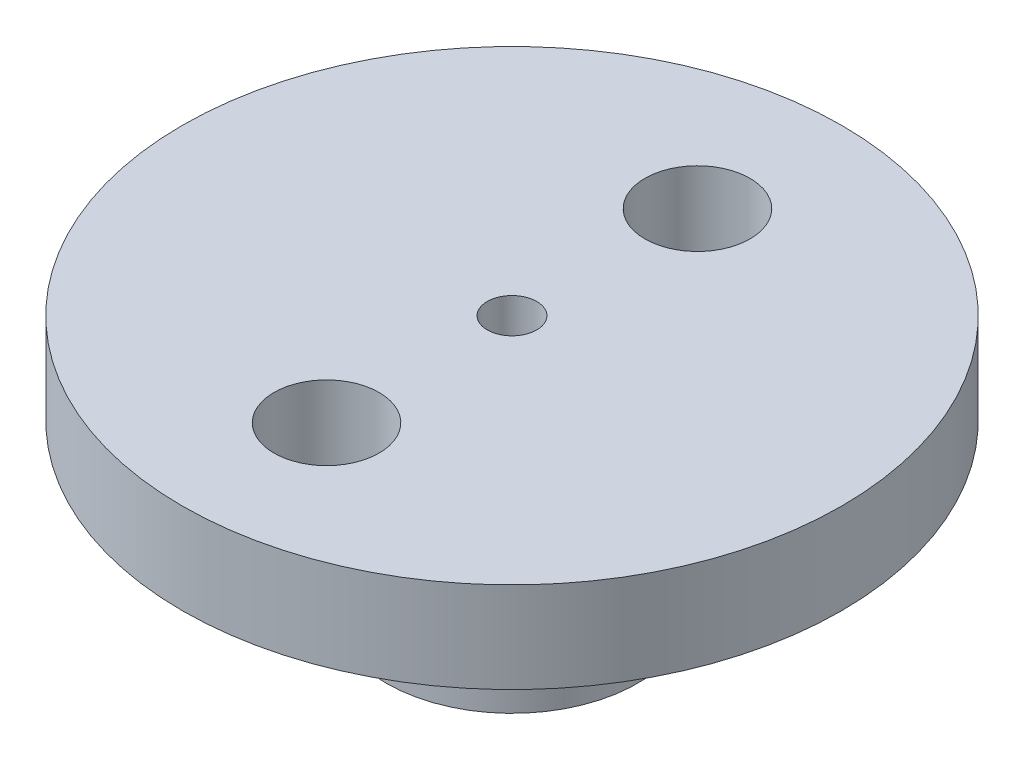
ISO-10303-21;
HEADER;
FILE_DESCRIPTION(('STEP AP214'),'2;1');
FILE_NAME('part.step','',(''),(''),'','','');
FILE_SCHEMA(('AUTOMOTIVE_DESIGN { 1 0 10303 214 1 1 1 1 }'));
ENDSEC;
DATA;
#1=APPLICATION_CONTEXT('core data for automotive mechanical design processes');
#2=APPLICATION_PROTOCOL_DEFINITION('international standard','automotive_design',2000,#1);
#3=PRODUCT_CONTEXT('',#1,'mechanical');
#4=PRODUCT('Part','Part','',(#3));
#5=PRODUCT_RELATED_PRODUCT_CATEGORY('part','',(#4));
#6=PRODUCT_DEFINITION_FORMATION('','',#4);
#7=PRODUCT_DEFINITION_CONTEXT('part definition',#1,'design');
#8=PRODUCT_DEFINITION('design','',#6,#7);
#9=PRODUCT_DEFINITION_SHAPE('','',#8);
#10=(LENGTH_UNIT() NAMED_UNIT(*) SI_UNIT(.MILLI.,.METRE.));
#11=(NAMED_UNIT(*) PLANE_ANGLE_UNIT() SI_UNIT($,.RADIAN.));
#12=(NAMED_UNIT(*) SI_UNIT($,.STERADIAN.) SOLID_ANGLE_UNIT());
#13=UNCERTAINTY_MEASURE_WITH_UNIT(LENGTH_MEASURE(1.E-05),#10,'distance_accuracy_value','');
#14=(GEOMETRIC_REPRESENTATION_CONTEXT(3) GLOBAL_UNCERTAINTY_ASSIGNED_CONTEXT((#13)) GLOBAL_UNIT_ASSIGNED_CONTEXT((#10,
#11,#12)) REPRESENTATION_CONTEXT('',''));
#15=CARTESIAN_POINT('',(0.,0.,0.));
#16=DIRECTION('',(0.,0.,1.));
#17=DIRECTION('',(1.,0.,0.));
#18=AXIS2_PLACEMENT_3D('',#15,#16,#17);
#19=CARTESIAN_POINT('',(0.,2.2,0.));
#20=DIRECTION('',(0.,-1.,0.));
#21=DIRECTION('',(0.,0.,-1.));
#22=AXIS2_PLACEMENT_3D('',#19,#20,#21);
#23=CYLINDRICAL_SURFACE('',#22,8.);
#24=CARTESIAN_POINT('',(0.,2.2,0.));
#25=DIRECTION('',(0.,1.,0.));
#26=DIRECTION('',(0.,0.,1.));
#27=AXIS2_PLACEMENT_3D('',#24,#25,#26);
#28=CIRCLE('',#27,8.);
#29=CARTESIAN_POINT('',(0.,2.2,8.));
#30=VERTEX_POINT('',#29);
#31=EDGE_CURVE('E44',#30,#30,#28,.T.);
#32=ORIENTED_EDGE('',*,*,#31,.F.);
#33=EDGE_LOOP('',(#32));
#34=FACE_BOUND('',#33,.T.);
#35=CARTESIAN_POINT('',(0.,0.,0.));
#36=DIRECTION('',(0.,1.,0.));
#37=DIRECTION('',(0.,0.,1.));
#38=AXIS2_PLACEMENT_3D('',#35,#36,#37);
#39=CIRCLE('',#38,8.);
#40=CARTESIAN_POINT('',(0.,0.,8.));
#41=VERTEX_POINT('',#40);
#42=EDGE_CURVE('E49',#41,#41,#39,.T.);
#43=ORIENTED_EDGE('',*,*,#42,.T.);
#44=EDGE_LOOP('',(#43));
#45=FACE_BOUND('',#44,.T.);
#46=ADVANCED_FACE('F37',(#34,#45),#23,.T.);
#47=CARTESIAN_POINT('',(0.,2.2,0.));
#48=DIRECTION('',(0.,1.,0.));
#49=DIRECTION('',(0.,0.,1.));
#50=AXIS2_PLACEMENT_3D('',#47,#48,#49);
#51=PLANE('',#50);
#52=CARTESIAN_POINT('',(0.,2.2,0.));
#53=DIRECTION('',(0.,1.,0.));
#54=DIRECTION('',(0.,0.,1.));
#55=AXIS2_PLACEMENT_3D('',#52,#53,#54);
#56=CIRCLE('',#55,0.6);
#57=CARTESIAN_POINT('',(0.,2.2,0.6));
#58=VERTEX_POINT('',#57);
#59=EDGE_CURVE('E81',#58,#58,#56,.F.);
#60=ORIENTED_EDGE('',*,*,#59,.T.);
#61=EDGE_LOOP('',(#60));
#62=FACE_BOUND('',#61,.T.);
#63=CARTESIAN_POINT('',(0.,2.2,4.50000000000001));
#64=DIRECTION('',(0.,1.,0.));
#65=DIRECTION('',(0.,0.,-1.));
#66=AXIS2_PLACEMENT_3D('',#63,#64,#65);
#67=CIRCLE('',#66,1.275);
#68=CARTESIAN_POINT('',(0.,2.2,3.22500000000001));
#69=VERTEX_POINT('',#68);
#70=EDGE_CURVE('E66',#69,#69,#67,.T.);
#71=ORIENTED_EDGE('',*,*,#70,.F.);
#72=EDGE_LOOP('',(#71));
#73=FACE_BOUND('',#72,.T.);
#74=CARTESIAN_POINT('',(0.,2.2,-4.5));
#75=DIRECTION('',(0.,1.,0.));
#76=DIRECTION('',(0.,0.,1.));
#77=AXIS2_PLACEMENT_3D('',#74,#75,#76);
#78=CIRCLE('',#77,1.275);
#79=CARTESIAN_POINT('',(0.,2.2,-3.225));
#80=VERTEX_POINT('',#79);
#81=EDGE_CURVE('E57',#80,#80,#78,.T.);
#82=ORIENTED_EDGE('',*,*,#81,.F.);
#83=EDGE_LOOP('',(#82));
#84=FACE_BOUND('',#83,.T.);
#85=ORIENTED_EDGE('',*,*,#31,.T.);
#86=EDGE_LOOP('',(#85));
#87=FACE_BOUND('',#86,.T.);
#88=ADVANCED_FACE('F116',(#62,#73,#84,#87),#51,.T.);
#89=CARTESIAN_POINT('',(0.,0.,0.));
#90=DIRECTION('',(0.,1.,0.));
#91=DIRECTION('',(0.,0.,1.));
#92=AXIS2_PLACEMENT_3D('',#89,#90,#91);
#93=PLANE('',#92);
#94=CARTESIAN_POINT('',(0.,0.,0.));
#95=DIRECTION('',(0.,1.,0.));
#96=DIRECTION('',(0.,0.,1.));
#97=AXIS2_PLACEMENT_3D('',#94,#95,#96);
#98=CIRCLE('',#97,3.05);
#99=CARTESIAN_POINT('',(0.,0.,3.05));
#100=VERTEX_POINT('',#99);
#101=EDGE_CURVE('E10',#100,#100,#98,.F.);
#102=ORIENTED_EDGE('',*,*,#101,.F.);
#103=EDGE_LOOP('',(#102));
#104=FACE_BOUND('',#103,.T.);
#105=CARTESIAN_POINT('',(0.,0.,4.50000000000001));
#106=DIRECTION('',(0.,1.,0.));
#107=DIRECTION('',(0.,0.,-1.));
#108=AXIS2_PLACEMENT_3D('',#105,#106,#107);
#109=CIRCLE('',#108,1.275);
#110=CARTESIAN_POINT('',(0.,0.,3.22500000000001));
#111=VERTEX_POINT('',#110);
#112=EDGE_CURVE('E55',#111,#111,#109,.T.);
#113=ORIENTED_EDGE('',*,*,#112,.T.);
#114=EDGE_LOOP('',(#113));
#115=FACE_BOUND('',#114,.T.);
#116=CARTESIAN_POINT('',(0.,0.,-4.5));
#117=DIRECTION('',(0.,1.,0.));
#118=DIRECTION('',(0.,0.,1.));
#119=AXIS2_PLACEMENT_3D('',#116,#117,#118);
#120=CIRCLE('',#119,1.275);
#121=CARTESIAN_POINT('',(0.,0.,-3.225));
#122=VERTEX_POINT('',#121);
#123=EDGE_CURVE('E61',#122,#122,#120,.T.);
#124=ORIENTED_EDGE('',*,*,#123,.T.);
#125=EDGE_LOOP('',(#124));
#126=FACE_BOUND('',#125,.T.);
#127=ORIENTED_EDGE('',*,*,#42,.F.);
#128=EDGE_LOOP('',(#127));
#129=FACE_BOUND('',#128,.T.);
#130=ADVANCED_FACE('F100',(#104,#115,#126,#129),#93,.F.);
#131=CARTESIAN_POINT('',(0.,0.,-4.5));
#132=DIRECTION('',(0.,1.,0.));
#133=DIRECTION('',(0.,0.,1.));
#134=AXIS2_PLACEMENT_3D('',#131,#132,#133);
#135=CYLINDRICAL_SURFACE('',#134,1.275);
#136=ORIENTED_EDGE('',*,*,#123,.F.);
#137=EDGE_LOOP('',(#136));
#138=FACE_BOUND('',#137,.T.);
#139=ORIENTED_EDGE('',*,*,#81,.T.);
#140=EDGE_LOOP('',(#139));
#141=FACE_BOUND('',#140,.T.);
#142=ADVANCED_FACE('F127',(#138,#141),#135,.F.);
#143=CARTESIAN_POINT('',(0.,0.,4.50000000000001));
#144=DIRECTION('',(0.,1.,0.));
#145=DIRECTION('',(0.,0.,1.));
#146=AXIS2_PLACEMENT_3D('',#143,#144,#145);
#147=CYLINDRICAL_SURFACE('',#146,1.275);
#148=ORIENTED_EDGE('',*,*,#112,.F.);
#149=EDGE_LOOP('',(#148));
#150=FACE_BOUND('',#149,.T.);
#151=ORIENTED_EDGE('',*,*,#70,.T.);
#152=EDGE_LOOP('',(#151));
#153=FACE_BOUND('',#152,.T.);
#154=ADVANCED_FACE('F132',(#150,#153),#147,.F.);
#155=CARTESIAN_POINT('',(0.,-4.,0.));
#156=DIRECTION('',(0.,-1.,0.));
#157=DIRECTION('',(0.,0.,-1.));
#158=AXIS2_PLACEMENT_3D('',#155,#156,#157);
#159=PLANE('',#158);
#160=CARTESIAN_POINT('',(0.,-4.,0.));
#161=DIRECTION('',(0.,-1.,0.));
#162=DIRECTION('',(0.,0.,-1.));
#163=AXIS2_PLACEMENT_3D('',#160,#161,#162);
#164=CIRCLE('',#163,3.05);
#165=CARTESIAN_POINT('',(0.,-4.,-3.05));
#166=VERTEX_POINT('',#165);
#167=EDGE_CURVE('E62',#166,#166,#164,.T.);
#168=ORIENTED_EDGE('',*,*,#167,.T.);
#169=EDGE_LOOP('',(#168));
#170=FACE_BOUND('',#169,.T.);
#171=CARTESIAN_POINT('',(0.,-4.,0.));
#172=DIRECTION('',(0.,-1.,0.));
#173=DIRECTION('',(0.,0.,-1.));
#174=AXIS2_PLACEMENT_3D('',#171,#172,#173);
#175=CIRCLE('',#174,2.3);
#176=CARTESIAN_POINT('',(0.,-4.,-2.3));
#177=VERTEX_POINT('',#176);
#178=EDGE_CURVE('E76',#177,#177,#175,.T.);
#179=ORIENTED_EDGE('',*,*,#178,.F.);
#180=EDGE_LOOP('',(#179));
#181=FACE_BOUND('',#180,.T.);
#182=ADVANCED_FACE('F110',(#170,#181),#159,.T.);
#183=CARTESIAN_POINT('',(0.,-4.,0.));
#184=DIRECTION('',(0.,1.,0.));
#185=DIRECTION('',(0.,0.,1.));
#186=AXIS2_PLACEMENT_3D('',#183,#184,#185);
#187=CYLINDRICAL_SURFACE('',#186,3.05);
#188=ORIENTED_EDGE('',*,*,#167,.F.);
#189=EDGE_LOOP('',(#188));
#190=FACE_BOUND('',#189,.T.);
#191=ORIENTED_EDGE('',*,*,#101,.T.);
#192=EDGE_LOOP('',(#191));
#193=FACE_BOUND('',#192,.T.);
#194=ADVANCED_FACE('F104',(#190,#193),#187,.T.);
#195=CARTESIAN_POINT('',(0.,-4.,0.));
#196=DIRECTION('',(0.,1.,0.));
#197=DIRECTION('',(0.,0.,1.));
#198=AXIS2_PLACEMENT_3D('',#195,#196,#197);
#199=CYLINDRICAL_SURFACE('',#198,2.3);
#200=ORIENTED_EDGE('',*,*,#178,.T.);
#201=EDGE_LOOP('',(#200));
#202=FACE_BOUND('',#201,.T.);
#203=CARTESIAN_POINT('',(0.,0.,0.));
#204=DIRECTION('',(0.,-1.,0.));
#205=DIRECTION('',(0.,0.,-1.));
#206=AXIS2_PLACEMENT_3D('',#203,#204,#205);
#207=CIRCLE('',#206,2.3);
#208=CARTESIAN_POINT('',(0.,0.,-2.3));
#209=VERTEX_POINT('',#208);
#210=EDGE_CURVE('E77',#209,#209,#207,.T.);
#211=ORIENTED_EDGE('',*,*,#210,.F.);
#212=EDGE_LOOP('',(#211));
#213=FACE_BOUND('',#212,.T.);
#214=ADVANCED_FACE('F99',(#202,#213),#199,.F.);
#215=CARTESIAN_POINT('',(0.,0.,0.));
#216=DIRECTION('',(0.,-1.,0.));
#217=DIRECTION('',(0.,0.,-1.));
#218=AXIS2_PLACEMENT_3D('',#215,#216,#217);
#219=CIRCLE('',#218,0.6);
#220=CARTESIAN_POINT('',(0.,0.,-0.6));
#221=VERTEX_POINT('',#220);
#222=EDGE_CURVE('E88',#221,#221,#219,.T.);
#223=ORIENTED_EDGE('',*,*,#222,.F.);
#224=EDGE_LOOP('',(#223));
#225=FACE_BOUND('',#224,.T.);
#226=ORIENTED_EDGE('',*,*,#210,.T.);
#227=EDGE_LOOP('',(#226));
#228=FACE_BOUND('',#227,.T.);
#229=ADVANCED_FACE('F96',(#225,#228),#93,.F.);
#230=CARTESIAN_POINT('',(0.,3.89705627484771,0.));
#231=DIRECTION('',(0.,-1.,0.));
#232=DIRECTION('',(0.,0.,-1.));
#233=AXIS2_PLACEMENT_3D('',#230,#231,#232);
#234=CYLINDRICAL_SURFACE('',#233,0.6);
#235=ORIENTED_EDGE('',*,*,#222,.T.);
#236=EDGE_LOOP('',(#235));
#237=FACE_BOUND('',#236,.T.);
#238=ORIENTED_EDGE('',*,*,#59,.F.);
#239=EDGE_LOOP('',(#238));
#240=FACE_BOUND('',#239,.T.);
#241=ADVANCED_FACE('F93',(#237,#240),#234,.F.);
#242=CLOSED_SHELL('',(#46,#88,#130,#142,#154,#182,#194,#214,#229,#241));
#243=MANIFOLD_SOLID_BREP('B2',#242);
#244=ADVANCED_BREP_SHAPE_REPRESENTATION('',(#18,#243),#14);
#245=SHAPE_DEFINITION_REPRESENTATION(#9,#244);
ENDSEC;
END-ISO-10303-21;
